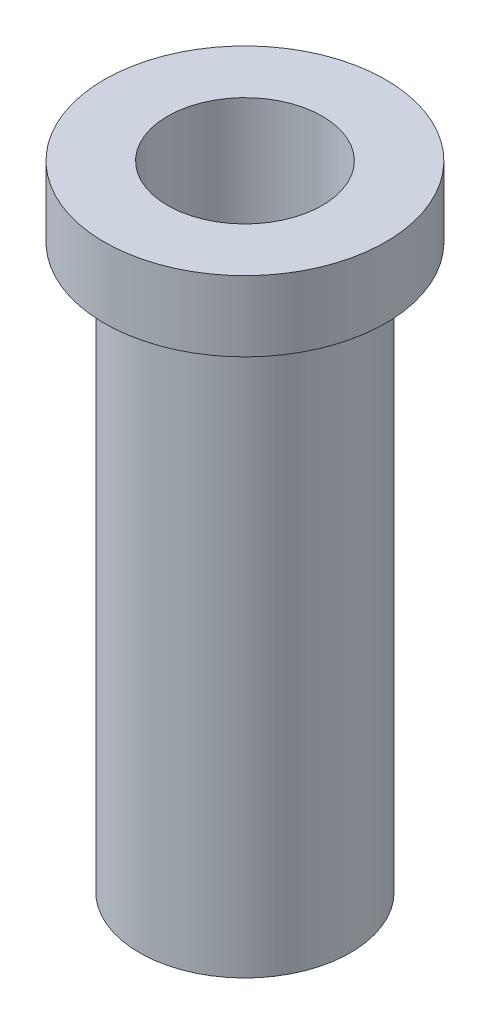
ISO-10303-21;
HEADER;
FILE_DESCRIPTION(('STEP AP214'),'2;1');
FILE_NAME('part.step','',(''),(''),'','','');
FILE_SCHEMA(('AUTOMOTIVE_DESIGN { 1 0 10303 214 1 1 1 1 }'));
ENDSEC;
DATA;
#1=APPLICATION_CONTEXT('core data for automotive mechanical design processes');
#2=APPLICATION_PROTOCOL_DEFINITION('international standard','automotive_design',2000,#1);
#3=PRODUCT_CONTEXT('',#1,'mechanical');
#4=PRODUCT('Part','Part','',(#3));
#5=PRODUCT_RELATED_PRODUCT_CATEGORY('part','',(#4));
#6=PRODUCT_DEFINITION_FORMATION('','',#4);
#7=PRODUCT_DEFINITION_CONTEXT('part definition',#1,'design');
#8=PRODUCT_DEFINITION('design','',#6,#7);
#9=PRODUCT_DEFINITION_SHAPE('','',#8);
#10=(LENGTH_UNIT() NAMED_UNIT(*) SI_UNIT(.MILLI.,.METRE.));
#11=(NAMED_UNIT(*) PLANE_ANGLE_UNIT() SI_UNIT($,.RADIAN.));
#12=(NAMED_UNIT(*) SI_UNIT($,.STERADIAN.) SOLID_ANGLE_UNIT());
#13=UNCERTAINTY_MEASURE_WITH_UNIT(LENGTH_MEASURE(1.E-05),#10,'distance_accuracy_value','');
#14=(GEOMETRIC_REPRESENTATION_CONTEXT(3) GLOBAL_UNCERTAINTY_ASSIGNED_CONTEXT((#13)) GLOBAL_UNIT_ASSIGNED_CONTEXT((#10,
#11,#12)) REPRESENTATION_CONTEXT('',''));
#15=CARTESIAN_POINT('',(0.,0.,0.));
#16=DIRECTION('',(0.,0.,1.));
#17=DIRECTION('',(1.,0.,0.));
#18=AXIS2_PLACEMENT_3D('',#15,#16,#17);
#19=CARTESIAN_POINT('',(10.,21.5665928449744,0.));
#20=DIRECTION('',(0.,-1.,0.));
#21=DIRECTION('',(1.,0.,0.));
#22=AXIS2_PLACEMENT_3D('',#19,#20,#21);
#23=PLANE('',#22);
#24=CARTESIAN_POINT('',(0.,21.5665928449744,0.));
#25=DIRECTION('',(0.,1.,0.));
#26=DIRECTION('',(-1.,0.,0.));
#27=AXIS2_PLACEMENT_3D('',#24,#25,#26);
#28=CIRCLE('',#27,5.5);
#29=CARTESIAN_POINT('',(-5.5,21.5665928449744,0.));
#30=VERTEX_POINT('',#29);
#31=EDGE_CURVE('E10',#30,#30,#28,.T.);
#32=ORIENTED_EDGE('',*,*,#31,.F.);
#33=EDGE_LOOP('',(#32));
#34=FACE_BOUND('',#33,.T.);
#35=CARTESIAN_POINT('',(0.,21.5665928449744,0.));
#36=DIRECTION('',(0.,1.,0.));
#37=DIRECTION('',(-1.,0.,0.));
#38=AXIS2_PLACEMENT_3D('',#35,#36,#37);
#39=CIRCLE('',#38,10.);
#40=CARTESIAN_POINT('',(-10.,21.5665928449744,0.));
#41=VERTEX_POINT('',#40);
#42=EDGE_CURVE('E57',#41,#41,#39,.T.);
#43=ORIENTED_EDGE('',*,*,#42,.T.);
#44=EDGE_LOOP('',(#43));
#45=FACE_BOUND('',#44,.T.);
#46=ADVANCED_FACE('F35',(#34,#45),#23,.F.);
#47=CARTESIAN_POINT('',(0.,21.5665928449744,0.));
#48=DIRECTION('',(0.,1.,0.));
#49=DIRECTION('',(-1.,0.,0.));
#50=AXIS2_PLACEMENT_3D('',#47,#48,#49);
#51=CYLINDRICAL_SURFACE('',#50,5.5);
#52=CARTESIAN_POINT('',(0.,-23.4334071550256,0.));
#53=DIRECTION('',(0.,1.,0.));
#54=DIRECTION('',(-1.,0.,0.));
#55=AXIS2_PLACEMENT_3D('',#52,#53,#54);
#56=CIRCLE('',#55,5.5);
#57=CARTESIAN_POINT('',(-5.5,-23.4334071550256,0.));
#58=VERTEX_POINT('',#57);
#59=EDGE_CURVE('E41',#58,#58,#56,.T.);
#60=ORIENTED_EDGE('',*,*,#59,.F.);
#61=EDGE_LOOP('',(#60));
#62=FACE_BOUND('',#61,.T.);
#63=ORIENTED_EDGE('',*,*,#31,.T.);
#64=EDGE_LOOP('',(#63));
#65=FACE_BOUND('',#64,.T.);
#66=ADVANCED_FACE('F82',(#62,#65),#51,.F.);
#67=CARTESIAN_POINT('',(5.50000000000001,-23.4334071550256,0.));
#68=DIRECTION('',(0.,1.,0.));
#69=DIRECTION('',(-1.,0.,0.));
#70=AXIS2_PLACEMENT_3D('',#67,#68,#69);
#71=PLANE('',#70);
#72=CARTESIAN_POINT('',(0.,-23.4334071550256,0.));
#73=DIRECTION('',(0.,1.,0.));
#74=DIRECTION('',(-1.,0.,0.));
#75=AXIS2_PLACEMENT_3D('',#72,#73,#74);
#76=CIRCLE('',#75,7.5);
#77=CARTESIAN_POINT('',(-7.49999999999999,-23.4334071550256,0.));
#78=VERTEX_POINT('',#77);
#79=EDGE_CURVE('E45',#78,#78,#76,.T.);
#80=ORIENTED_EDGE('',*,*,#79,.F.);
#81=EDGE_LOOP('',(#80));
#82=FACE_BOUND('',#81,.T.);
#83=ORIENTED_EDGE('',*,*,#59,.T.);
#84=EDGE_LOOP('',(#83));
#85=FACE_BOUND('',#84,.T.);
#86=ADVANCED_FACE('F77',(#82,#85),#71,.F.);
#87=CARTESIAN_POINT('',(0.,21.5665928449744,0.));
#88=DIRECTION('',(0.,1.,0.));
#89=DIRECTION('',(-1.,0.,0.));
#90=AXIS2_PLACEMENT_3D('',#87,#88,#89);
#91=CYLINDRICAL_SURFACE('',#90,7.5);
#92=CARTESIAN_POINT('',(0.,16.5665928449744,0.));
#93=DIRECTION('',(0.,1.,0.));
#94=DIRECTION('',(-1.,0.,0.));
#95=AXIS2_PLACEMENT_3D('',#92,#93,#94);
#96=CIRCLE('',#95,7.5);
#97=CARTESIAN_POINT('',(-7.5,16.5665928449744,0.));
#98=VERTEX_POINT('',#97);
#99=EDGE_CURVE('E49',#98,#98,#96,.T.);
#100=ORIENTED_EDGE('',*,*,#99,.F.);
#101=EDGE_LOOP('',(#100));
#102=FACE_BOUND('',#101,.T.);
#103=ORIENTED_EDGE('',*,*,#79,.T.);
#104=EDGE_LOOP('',(#103));
#105=FACE_BOUND('',#104,.T.);
#106=ADVANCED_FACE('F71',(#102,#105),#91,.T.);
#107=CARTESIAN_POINT('',(7.5,16.5665928449744,0.));
#108=DIRECTION('',(0.,1.,0.));
#109=DIRECTION('',(-1.,0.,0.));
#110=AXIS2_PLACEMENT_3D('',#107,#108,#109);
#111=PLANE('',#110);
#112=CARTESIAN_POINT('',(0.,16.5665928449744,0.));
#113=DIRECTION('',(0.,1.,0.));
#114=DIRECTION('',(-1.,0.,0.));
#115=AXIS2_PLACEMENT_3D('',#112,#113,#114);
#116=CIRCLE('',#115,10.);
#117=CARTESIAN_POINT('',(-10.,16.5665928449744,0.));
#118=VERTEX_POINT('',#117);
#119=EDGE_CURVE('E54',#118,#118,#116,.T.);
#120=ORIENTED_EDGE('',*,*,#119,.F.);
#121=EDGE_LOOP('',(#120));
#122=FACE_BOUND('',#121,.T.);
#123=ORIENTED_EDGE('',*,*,#99,.T.);
#124=EDGE_LOOP('',(#123));
#125=FACE_BOUND('',#124,.T.);
#126=ADVANCED_FACE('F65',(#122,#125),#111,.F.);
#127=CARTESIAN_POINT('',(0.,21.5665928449744,0.));
#128=DIRECTION('',(0.,1.,0.));
#129=DIRECTION('',(-1.,0.,0.));
#130=AXIS2_PLACEMENT_3D('',#127,#128,#129);
#131=CYLINDRICAL_SURFACE('',#130,10.);
#132=ORIENTED_EDGE('',*,*,#42,.F.);
#133=EDGE_LOOP('',(#132));
#134=FACE_BOUND('',#133,.T.);
#135=ORIENTED_EDGE('',*,*,#119,.T.);
#136=EDGE_LOOP('',(#135));
#137=FACE_BOUND('',#136,.T.);
#138=ADVANCED_FACE('F62',(#134,#137),#131,.T.);
#139=CLOSED_SHELL('',(#46,#66,#86,#106,#126,#138));
#140=MANIFOLD_SOLID_BREP('B2',#139);
#141=ADVANCED_BREP_SHAPE_REPRESENTATION('',(#18,#140),#14);
#142=SHAPE_DEFINITION_REPRESENTATION(#9,#141);
ENDSEC;
END-ISO-10303-21;
